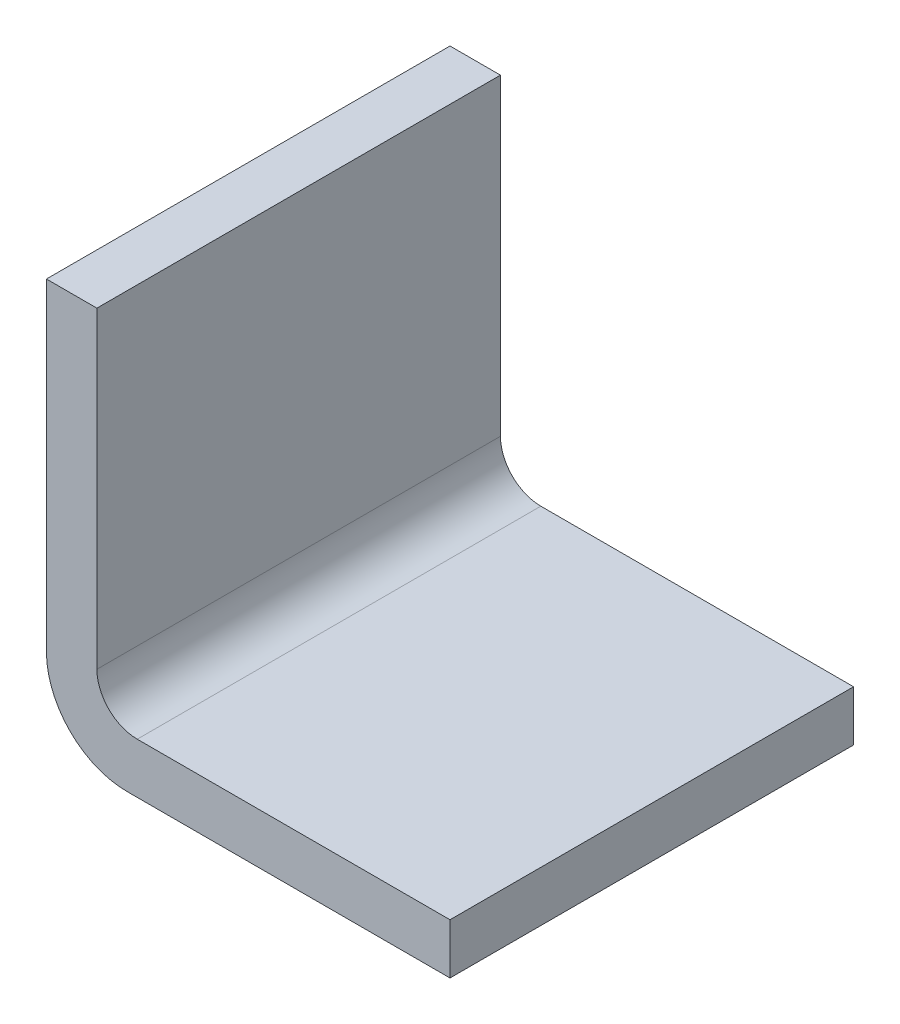
ISO-10303-21;
HEADER;
FILE_DESCRIPTION(('STEP AP214'),'2;1');
FILE_NAME('part.step','',(''),(''),'','','');
FILE_SCHEMA(('AUTOMOTIVE_DESIGN { 1 0 10303 214 1 1 1 1 }'));
ENDSEC;
DATA;
#1=APPLICATION_CONTEXT('core data for automotive mechanical design processes');
#2=APPLICATION_PROTOCOL_DEFINITION('international standard','automotive_design',2000,#1);
#3=PRODUCT_CONTEXT('',#1,'mechanical');
#4=PRODUCT('Part','Part','',(#3));
#5=PRODUCT_RELATED_PRODUCT_CATEGORY('part','',(#4));
#6=PRODUCT_DEFINITION_FORMATION('','',#4);
#7=PRODUCT_DEFINITION_CONTEXT('part definition',#1,'design');
#8=PRODUCT_DEFINITION('design','',#6,#7);
#9=PRODUCT_DEFINITION_SHAPE('','',#8);
#10=(LENGTH_UNIT() NAMED_UNIT(*) SI_UNIT(.MILLI.,.METRE.));
#11=(NAMED_UNIT(*) PLANE_ANGLE_UNIT() SI_UNIT($,.RADIAN.));
#12=(NAMED_UNIT(*) SI_UNIT($,.STERADIAN.) SOLID_ANGLE_UNIT());
#13=UNCERTAINTY_MEASURE_WITH_UNIT(LENGTH_MEASURE(1.E-05),#10,'distance_accuracy_value','');
#14=(GEOMETRIC_REPRESENTATION_CONTEXT(3) GLOBAL_UNCERTAINTY_ASSIGNED_CONTEXT((#13)) GLOBAL_UNIT_ASSIGNED_CONTEXT((#10,
#11,#12)) REPRESENTATION_CONTEXT('',''));
#15=CARTESIAN_POINT('',(0.,0.,0.));
#16=DIRECTION('',(0.,0.,1.));
#17=DIRECTION('',(1.,0.,0.));
#18=AXIS2_PLACEMENT_3D('',#15,#16,#17);
#19=CARTESIAN_POINT('',(12.7,0.,12.7));
#20=DIRECTION('',(-1.,0.,0.));
#21=DIRECTION('',(0.,0.,1.));
#22=AXIS2_PLACEMENT_3D('',#19,#20,#21);
#23=PLANE('',#22);
#24=DIRECTION('',(0.,1.,0.));
#25=VECTOR('',#24,1.);
#26=CARTESIAN_POINT('',(12.7,0.,0.));
#27=LINE('',#26,#25);
#28=CARTESIAN_POINT('',(12.7,0.,0.));
#29=VERTEX_POINT('',#28);
#30=CARTESIAN_POINT('',(12.7,1.5875,0.));
#31=VERTEX_POINT('',#30);
#32=EDGE_CURVE('E132',#29,#31,#27,.T.);
#33=ORIENTED_EDGE('',*,*,#32,.T.);
#34=DIRECTION('',(0.,0.,-1.));
#35=VECTOR('',#34,1.);
#36=CARTESIAN_POINT('',(12.7,1.5875,12.7));
#37=LINE('',#36,#35);
#38=CARTESIAN_POINT('',(12.7,1.5875,12.7));
#39=VERTEX_POINT('',#38);
#40=EDGE_CURVE('E11',#39,#31,#37,.T.);
#41=ORIENTED_EDGE('',*,*,#40,.F.);
#42=DIRECTION('',(0.,1.,0.));
#43=VECTOR('',#42,1.);
#44=CARTESIAN_POINT('',(12.7,0.,12.7));
#45=LINE('',#44,#43);
#46=CARTESIAN_POINT('',(12.7,0.,12.7));
#47=VERTEX_POINT('',#46);
#48=EDGE_CURVE('E146',#47,#39,#45,.T.);
#49=ORIENTED_EDGE('',*,*,#48,.F.);
#50=DIRECTION('',(0.,0.,-1.));
#51=VECTOR('',#50,1.);
#52=CARTESIAN_POINT('',(12.7,0.,12.7));
#53=LINE('',#52,#51);
#54=EDGE_CURVE('E128',#47,#29,#53,.T.);
#55=ORIENTED_EDGE('',*,*,#54,.T.);
#56=EDGE_LOOP('',(#33,#41,#49,#55));
#57=FACE_BOUND('',#56,.T.);
#58=ADVANCED_FACE('F36',(#57),#23,.F.);
#59=CARTESIAN_POINT('',(12.7,1.5875,12.7));
#60=DIRECTION('',(0.,-1.,0.));
#61=DIRECTION('',(1.,0.,0.));
#62=AXIS2_PLACEMENT_3D('',#59,#60,#61);
#63=PLANE('',#62);
#64=DIRECTION('',(-1.,0.,0.));
#65=VECTOR('',#64,1.);
#66=CARTESIAN_POINT('',(12.7,1.5875,0.));
#67=LINE('',#66,#65);
#68=CARTESIAN_POINT('',(2.8575,1.5875,0.));
#69=VERTEX_POINT('',#68);
#70=EDGE_CURVE('E135',#31,#69,#67,.T.);
#71=ORIENTED_EDGE('',*,*,#70,.T.);
#72=DIRECTION('',(0.,0.,-1.));
#73=VECTOR('',#72,1.);
#74=CARTESIAN_POINT('',(2.8575,1.5875,12.7));
#75=LINE('',#74,#73);
#76=CARTESIAN_POINT('',(2.8575,1.5875,12.7));
#77=VERTEX_POINT('',#76);
#78=EDGE_CURVE('E44',#77,#69,#75,.T.);
#79=ORIENTED_EDGE('',*,*,#78,.F.);
#80=DIRECTION('',(-1.,0.,0.));
#81=VECTOR('',#80,1.);
#82=CARTESIAN_POINT('',(12.7,1.5875,12.7));
#83=LINE('',#82,#81);
#84=EDGE_CURVE('E95',#39,#77,#83,.T.);
#85=ORIENTED_EDGE('',*,*,#84,.F.);
#86=ORIENTED_EDGE('',*,*,#40,.T.);
#87=EDGE_LOOP('',(#71,#79,#85,#86));
#88=FACE_BOUND('',#87,.T.);
#89=ADVANCED_FACE('F181',(#88),#63,.F.);
#90=CARTESIAN_POINT('',(2.8575,2.8575,12.7));
#91=DIRECTION('',(0.,0.,-1.));
#92=DIRECTION('',(-1.,0.,0.));
#93=AXIS2_PLACEMENT_3D('',#90,#91,#92);
#94=CYLINDRICAL_SURFACE('',#93,1.27);
#95=CARTESIAN_POINT('',(2.8575,2.8575,0.));
#96=DIRECTION('',(0.,0.,-1.));
#97=DIRECTION('',(-1.,0.,0.));
#98=AXIS2_PLACEMENT_3D('',#95,#96,#97);
#99=CIRCLE('',#98,1.27);
#100=CARTESIAN_POINT('',(1.5875,2.8575,0.));
#101=VERTEX_POINT('',#100);
#102=EDGE_CURVE('E137',#69,#101,#99,.T.);
#103=ORIENTED_EDGE('',*,*,#102,.T.);
#104=DIRECTION('',(0.,0.,-1.));
#105=VECTOR('',#104,1.);
#106=CARTESIAN_POINT('',(1.5875,2.8575,12.7));
#107=LINE('',#106,#105);
#108=CARTESIAN_POINT('',(1.5875,2.8575,12.7));
#109=VERTEX_POINT('',#108);
#110=EDGE_CURVE('E153',#109,#101,#107,.T.);
#111=ORIENTED_EDGE('',*,*,#110,.F.);
#112=CARTESIAN_POINT('',(2.8575,2.8575,12.7));
#113=DIRECTION('',(0.,0.,-1.));
#114=DIRECTION('',(-1.,0.,0.));
#115=AXIS2_PLACEMENT_3D('',#112,#113,#114);
#116=CIRCLE('',#115,1.27);
#117=EDGE_CURVE('E161',#77,#109,#116,.T.);
#118=ORIENTED_EDGE('',*,*,#117,.F.);
#119=ORIENTED_EDGE('',*,*,#78,.T.);
#120=EDGE_LOOP('',(#103,#111,#118,#119));
#121=FACE_BOUND('',#120,.T.);
#122=ADVANCED_FACE('F159',(#121),#94,.F.);
#123=CARTESIAN_POINT('',(1.5875,2.8575,12.7));
#124=DIRECTION('',(-1.,0.,0.));
#125=DIRECTION('',(0.,-1.,0.));
#126=AXIS2_PLACEMENT_3D('',#123,#124,#125);
#127=PLANE('',#126);
#128=DIRECTION('',(0.,1.,0.));
#129=VECTOR('',#128,1.);
#130=CARTESIAN_POINT('',(1.5875,2.8575,0.));
#131=LINE('',#130,#129);
#132=CARTESIAN_POINT('',(1.5875,12.7,0.));
#133=VERTEX_POINT('',#132);
#134=EDGE_CURVE('E139',#101,#133,#131,.T.);
#135=ORIENTED_EDGE('',*,*,#134,.T.);
#136=DIRECTION('',(0.,0.,-1.));
#137=VECTOR('',#136,1.);
#138=CARTESIAN_POINT('',(1.5875,12.7,12.7));
#139=LINE('',#138,#137);
#140=CARTESIAN_POINT('',(1.5875,12.7,12.7));
#141=VERTEX_POINT('',#140);
#142=EDGE_CURVE('E150',#141,#133,#139,.T.);
#143=ORIENTED_EDGE('',*,*,#142,.F.);
#144=DIRECTION('',(0.,1.,0.));
#145=VECTOR('',#144,1.);
#146=CARTESIAN_POINT('',(1.5875,2.8575,12.7));
#147=LINE('',#146,#145);
#148=EDGE_CURVE('E173',#109,#141,#147,.T.);
#149=ORIENTED_EDGE('',*,*,#148,.F.);
#150=ORIENTED_EDGE('',*,*,#110,.T.);
#151=EDGE_LOOP('',(#135,#143,#149,#150));
#152=FACE_BOUND('',#151,.T.);
#153=ADVANCED_FACE('F169',(#152),#127,.F.);
#154=CARTESIAN_POINT('',(1.5875,12.7,12.7));
#155=DIRECTION('',(0.,-1.,0.));
#156=DIRECTION('',(0.,0.,-1.));
#157=AXIS2_PLACEMENT_3D('',#154,#155,#156);
#158=PLANE('',#157);
#159=DIRECTION('',(-1.,0.,0.));
#160=VECTOR('',#159,1.);
#161=CARTESIAN_POINT('',(1.5875,12.7,0.));
#162=LINE('',#161,#160);
#163=CARTESIAN_POINT('',(0.,12.7,0.));
#164=VERTEX_POINT('',#163);
#165=EDGE_CURVE('E141',#133,#164,#162,.T.);
#166=ORIENTED_EDGE('',*,*,#165,.T.);
#167=DIRECTION('',(0.,0.,-1.));
#168=VECTOR('',#167,1.);
#169=CARTESIAN_POINT('',(0.,12.7,12.7));
#170=LINE('',#169,#168);
#171=CARTESIAN_POINT('',(0.,12.7,12.7));
#172=VERTEX_POINT('',#171);
#173=EDGE_CURVE('E123',#172,#164,#170,.T.);
#174=ORIENTED_EDGE('',*,*,#173,.F.);
#175=DIRECTION('',(-1.,0.,0.));
#176=VECTOR('',#175,1.);
#177=CARTESIAN_POINT('',(1.5875,12.7,12.7));
#178=LINE('',#177,#176);
#179=EDGE_CURVE('E114',#141,#172,#178,.T.);
#180=ORIENTED_EDGE('',*,*,#179,.F.);
#181=ORIENTED_EDGE('',*,*,#142,.T.);
#182=EDGE_LOOP('',(#166,#174,#180,#181));
#183=FACE_BOUND('',#182,.T.);
#184=ADVANCED_FACE('F172',(#183),#158,.F.);
#185=CARTESIAN_POINT('',(0.,12.7,12.7));
#186=DIRECTION('',(1.,0.,0.));
#187=DIRECTION('',(0.,1.,0.));
#188=AXIS2_PLACEMENT_3D('',#185,#186,#187);
#189=PLANE('',#188);
#190=DIRECTION('',(0.,-1.,0.));
#191=VECTOR('',#190,1.);
#192=CARTESIAN_POINT('',(0.,12.7,0.));
#193=LINE('',#192,#191);
#194=CARTESIAN_POINT('',(0.,2.54,0.));
#195=VERTEX_POINT('',#194);
#196=EDGE_CURVE('E122',#164,#195,#193,.T.);
#197=ORIENTED_EDGE('',*,*,#196,.T.);
#198=DIRECTION('',(0.,0.,-1.));
#199=VECTOR('',#198,1.);
#200=CARTESIAN_POINT('',(0.,2.54,12.7));
#201=LINE('',#200,#199);
#202=CARTESIAN_POINT('',(0.,2.54,12.7));
#203=VERTEX_POINT('',#202);
#204=EDGE_CURVE('E119',#203,#195,#201,.T.);
#205=ORIENTED_EDGE('',*,*,#204,.F.);
#206=DIRECTION('',(0.,-1.,0.));
#207=VECTOR('',#206,1.);
#208=CARTESIAN_POINT('',(0.,12.7,12.7));
#209=LINE('',#208,#207);
#210=EDGE_CURVE('E108',#172,#203,#209,.T.);
#211=ORIENTED_EDGE('',*,*,#210,.F.);
#212=ORIENTED_EDGE('',*,*,#173,.T.);
#213=EDGE_LOOP('',(#197,#205,#211,#212));
#214=FACE_BOUND('',#213,.T.);
#215=ADVANCED_FACE('F120',(#214),#189,.F.);
#216=CARTESIAN_POINT('',(2.54,2.54,12.7));
#217=DIRECTION('',(0.,0.,-1.));
#218=DIRECTION('',(-1.,0.,0.));
#219=AXIS2_PLACEMENT_3D('',#216,#217,#218);
#220=CYLINDRICAL_SURFACE('',#219,2.54);
#221=CARTESIAN_POINT('',(2.54,2.54,0.));
#222=DIRECTION('',(0.,0.,1.));
#223=DIRECTION('',(-1.,0.,0.));
#224=AXIS2_PLACEMENT_3D('',#221,#222,#223);
#225=CIRCLE('',#224,2.54);
#226=CARTESIAN_POINT('',(2.54000000000002,0.,0.));
#227=VERTEX_POINT('',#226);
#228=EDGE_CURVE('E81',#195,#227,#225,.T.);
#229=ORIENTED_EDGE('',*,*,#228,.T.);
#230=DIRECTION('',(0.,0.,-1.));
#231=VECTOR('',#230,1.);
#232=CARTESIAN_POINT('',(2.54000000000002,0.,12.7));
#233=LINE('',#232,#231);
#234=CARTESIAN_POINT('',(2.54000000000002,0.,12.7));
#235=VERTEX_POINT('',#234);
#236=EDGE_CURVE('E124',#235,#227,#233,.T.);
#237=ORIENTED_EDGE('',*,*,#236,.F.);
#238=CARTESIAN_POINT('',(2.54,2.54,12.7));
#239=DIRECTION('',(0.,0.,1.));
#240=DIRECTION('',(-1.,0.,0.));
#241=AXIS2_PLACEMENT_3D('',#238,#239,#240);
#242=CIRCLE('',#241,2.54);
#243=EDGE_CURVE('E112',#203,#235,#242,.T.);
#244=ORIENTED_EDGE('',*,*,#243,.F.);
#245=ORIENTED_EDGE('',*,*,#204,.T.);
#246=EDGE_LOOP('',(#229,#237,#244,#245));
#247=FACE_BOUND('',#246,.T.);
#248=ADVANCED_FACE('F126',(#247),#220,.T.);
#249=CARTESIAN_POINT('',(2.54000000000002,0.,12.7));
#250=DIRECTION('',(0.,1.,0.));
#251=DIRECTION('',(0.,0.,1.));
#252=AXIS2_PLACEMENT_3D('',#249,#250,#251);
#253=PLANE('',#252);
#254=DIRECTION('',(1.,0.,0.));
#255=VECTOR('',#254,1.);
#256=CARTESIAN_POINT('',(2.54000000000002,0.,0.));
#257=LINE('',#256,#255);
#258=EDGE_CURVE('E87',#227,#29,#257,.T.);
#259=ORIENTED_EDGE('',*,*,#258,.T.);
#260=ORIENTED_EDGE('',*,*,#54,.F.);
#261=DIRECTION('',(1.,0.,0.));
#262=VECTOR('',#261,1.);
#263=CARTESIAN_POINT('',(2.54000000000002,0.,12.7));
#264=LINE('',#263,#262);
#265=EDGE_CURVE('E52',#235,#47,#264,.T.);
#266=ORIENTED_EDGE('',*,*,#265,.F.);
#267=ORIENTED_EDGE('',*,*,#236,.T.);
#268=EDGE_LOOP('',(#259,#260,#266,#267));
#269=FACE_BOUND('',#268,.T.);
#270=ADVANCED_FACE('F197',(#269),#253,.F.);
#271=CARTESIAN_POINT('',(2.8575,2.8575,12.7));
#272=DIRECTION('',(0.,0.,-1.));
#273=DIRECTION('',(-1.,0.,0.));
#274=AXIS2_PLACEMENT_3D('',#271,#272,#273);
#275=PLANE('',#274);
#276=ORIENTED_EDGE('',*,*,#48,.T.);
#277=ORIENTED_EDGE('',*,*,#84,.T.);
#278=ORIENTED_EDGE('',*,*,#117,.T.);
#279=ORIENTED_EDGE('',*,*,#148,.T.);
#280=ORIENTED_EDGE('',*,*,#179,.T.);
#281=ORIENTED_EDGE('',*,*,#210,.T.);
#282=ORIENTED_EDGE('',*,*,#243,.T.);
#283=ORIENTED_EDGE('',*,*,#265,.T.);
#284=EDGE_LOOP('',(#276,#277,#278,#279,#280,#281,#282,#283));
#285=FACE_BOUND('',#284,.T.);
#286=ADVANCED_FACE('F110',(#285),#275,.F.);
#287=CARTESIAN_POINT('',(2.8575,2.8575,0.));
#288=DIRECTION('',(0.,0.,-1.));
#289=DIRECTION('',(-1.,0.,0.));
#290=AXIS2_PLACEMENT_3D('',#287,#288,#289);
#291=PLANE('',#290);
#292=ORIENTED_EDGE('',*,*,#32,.F.);
#293=ORIENTED_EDGE('',*,*,#258,.F.);
#294=ORIENTED_EDGE('',*,*,#228,.F.);
#295=ORIENTED_EDGE('',*,*,#196,.F.);
#296=ORIENTED_EDGE('',*,*,#165,.F.);
#297=ORIENTED_EDGE('',*,*,#134,.F.);
#298=ORIENTED_EDGE('',*,*,#102,.F.);
#299=ORIENTED_EDGE('',*,*,#70,.F.);
#300=EDGE_LOOP('',(#292,#293,#294,#295,#296,#297,#298,#299));
#301=FACE_BOUND('',#300,.T.);
#302=ADVANCED_FACE('F165',(#301),#291,.T.);
#303=CLOSED_SHELL('',(#58,#89,#122,#153,#184,#215,#248,#270,#286,#302));
#304=MANIFOLD_SOLID_BREP('B2',#303);
#305=ADVANCED_BREP_SHAPE_REPRESENTATION('',(#18,#304),#14);
#306=SHAPE_DEFINITION_REPRESENTATION(#9,#305);
ENDSEC;
END-ISO-10303-21;
